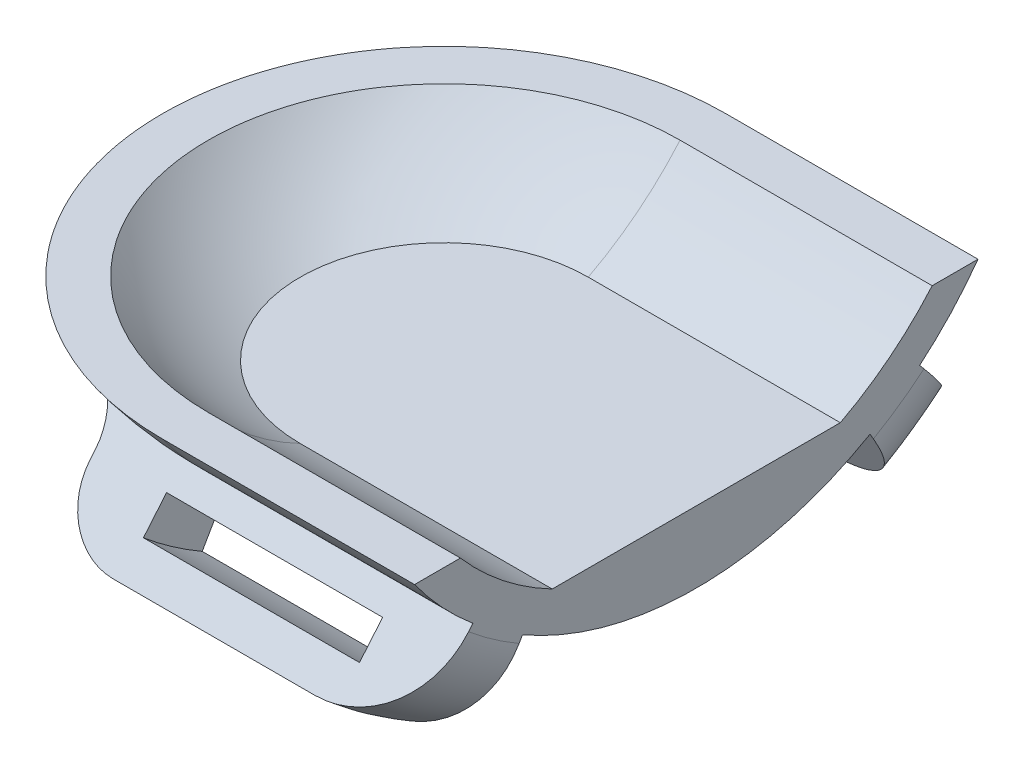
ISO-10303-21;
HEADER;
FILE_DESCRIPTION(('STEP AP214'),'2;1');
FILE_NAME('part.step','',(''),(''),'','','');
FILE_SCHEMA(('AUTOMOTIVE_DESIGN { 1 0 10303 214 1 1 1 1 }'));
ENDSEC;
DATA;
#1=APPLICATION_CONTEXT('core data for automotive mechanical design processes');
#2=APPLICATION_PROTOCOL_DEFINITION('international standard','automotive_design',2000,#1);
#3=PRODUCT_CONTEXT('',#1,'mechanical');
#4=PRODUCT('Part','Part','',(#3));
#5=PRODUCT_RELATED_PRODUCT_CATEGORY('part','',(#4));
#6=PRODUCT_DEFINITION_FORMATION('','',#4);
#7=PRODUCT_DEFINITION_CONTEXT('part definition',#1,'design');
#8=PRODUCT_DEFINITION('design','',#6,#7);
#9=PRODUCT_DEFINITION_SHAPE('','',#8);
#10=(LENGTH_UNIT() NAMED_UNIT(*) SI_UNIT(.MILLI.,.METRE.));
#11=(NAMED_UNIT(*) PLANE_ANGLE_UNIT() SI_UNIT($,.RADIAN.));
#12=(NAMED_UNIT(*) SI_UNIT($,.STERADIAN.) SOLID_ANGLE_UNIT());
#13=UNCERTAINTY_MEASURE_WITH_UNIT(LENGTH_MEASURE(1.E-05),#10,'distance_accuracy_value','');
#14=(GEOMETRIC_REPRESENTATION_CONTEXT(3) GLOBAL_UNCERTAINTY_ASSIGNED_CONTEXT((#13)) GLOBAL_UNIT_ASSIGNED_CONTEXT((#10,
#11,#12)) REPRESENTATION_CONTEXT('',''));
#15=CARTESIAN_POINT('',(0.,0.,0.));
#16=DIRECTION('',(0.,0.,1.));
#17=DIRECTION('',(1.,0.,0.));
#18=AXIS2_PLACEMENT_3D('',#15,#16,#17);
#19=CARTESIAN_POINT('',(-3.81,0.,0.));
#20=DIRECTION('',(0.,0.499999999999998,0.86602540378444));
#21=DIRECTION('',(0.,-0.86602540378444,0.499999999999998));
#22=AXIS2_PLACEMENT_3D('',#19,#20,#21);
#23=PLANE('',#22);
#24=DIRECTION('',(0.,-0.86602540378444,0.499999999999998));
#25=VECTOR('',#24,1.);
#26=CARTESIAN_POINT('',(8.89,0.,0.));
#27=LINE('',#26,#25);
#28=CARTESIAN_POINT('',(8.89,-10.6135743360802,6.12774999999997));
#29=VERTEX_POINT('',#28);
#30=CARTESIAN_POINT('',(8.89,-10.8196883821809,6.24674999999997));
#31=VERTEX_POINT('',#30);
#32=EDGE_CURVE('E296',#29,#31,#27,.T.);
#33=ORIENTED_EDGE('',*,*,#32,.T.);
#34=CARTESIAN_POINT('',(5.588,-10.8196883821809,6.24674999999997));
#35=DIRECTION('',(0.,0.499999999999998,0.86602540378444));
#36=DIRECTION('',(0.,-0.86602540378444,0.499999999999998));
#37=AXIS2_PLACEMENT_3D('',#34,#35,#36);
#38=CIRCLE('',#37,3.302);
#39=CARTESIAN_POINT('',(5.588,-13.6793042654771,7.89774999999996));
#40=VERTEX_POINT('',#39);
#41=EDGE_CURVE('E59',#31,#40,#38,.F.);
#42=ORIENTED_EDGE('',*,*,#41,.T.);
#43=DIRECTION('',(1.,0.,0.));
#44=VECTOR('',#43,1.);
#45=CARTESIAN_POINT('',(-3.81,-13.6793042654771,7.89774999999996));
#46=LINE('',#45,#44);
#47=CARTESIAN_POINT('',(-1.524,-13.6793042654771,7.89774999999996));
#48=VERTEX_POINT('',#47);
#49=EDGE_CURVE('E308',#48,#40,#46,.T.);
#50=ORIENTED_EDGE('',*,*,#49,.F.);
#51=CARTESIAN_POINT('',(-1.524,-11.6995701924259,6.75474999999997));
#52=DIRECTION('',(0.,0.499999999999998,0.86602540378444));
#53=DIRECTION('',(0.,-0.86602540378444,0.499999999999998));
#54=AXIS2_PLACEMENT_3D('',#51,#52,#53);
#55=CIRCLE('',#54,2.286);
#56=CARTESIAN_POINT('',(-3.81,-11.6995701924259,6.75474999999997));
#57=VERTEX_POINT('',#56);
#58=EDGE_CURVE('E404',#48,#57,#55,.F.);
#59=ORIENTED_EDGE('',*,*,#58,.T.);
#60=DIRECTION('',(0.,-0.86602540378444,0.499999999999998));
#61=VECTOR('',#60,1.);
#62=CARTESIAN_POINT('',(-3.81,0.,0.));
#63=LINE('',#62,#61);
#64=CARTESIAN_POINT('',(-3.81,-11.4333068133196,6.60102276639761));
#65=VERTEX_POINT('',#64);
#66=EDGE_CURVE('E297',#65,#57,#63,.T.);
#67=ORIENTED_EDGE('',*,*,#66,.F.);
#68=CARTESIAN_POINT('',(-6.096,-11.4333068133196,6.60102276639761));
#69=DIRECTION('',(0.,0.499999999999998,0.86602540378444));
#70=DIRECTION('',(0.,-0.86602540378444,0.499999999999998));
#71=AXIS2_PLACEMENT_3D('',#68,#69,#70);
#72=CIRCLE('',#71,2.286);
#73=CARTESIAN_POINT('',(-5.1376768558952,-9.63593106974097,5.56330739700759));
#74=VERTEX_POINT('',#73);
#75=EDGE_CURVE('E415',#65,#74,#72,.T.);
#76=ORIENTED_EDGE('',*,*,#75,.T.);
#77=CARTESIAN_POINT('',(0.,0.,0.));
#78=DIRECTION('',(0.,0.499999999999998,0.86602540378444));
#79=DIRECTION('',(0.,-0.86602540378444,0.499999999999998));
#80=AXIS2_PLACEMENT_3D('',#77,#78,#79);
#81=CIRCLE('',#80,12.2555);
#82=CARTESIAN_POINT('',(0.,-10.6135743360802,6.12774999999997));
#83=VERTEX_POINT('',#82);
#84=EDGE_CURVE('E316',#83,#74,#81,.F.);
#85=ORIENTED_EDGE('',*,*,#84,.F.);
#86=DIRECTION('',(-1.,0.,0.));
#87=VECTOR('',#86,1.);
#88=CARTESIAN_POINT('',(15.24,-10.6135743360802,6.12774999999997));
#89=LINE('',#88,#87);
#90=EDGE_CURVE('E318',#83,#29,#89,.F.);
#91=ORIENTED_EDGE('',*,*,#90,.T.);
#92=EDGE_LOOP('',(#33,#42,#50,#59,#67,#76,#85,#91));
#93=FACE_BOUND('',#92,.T.);
#94=DIRECTION('',(0.,-0.86602540378444,0.499999999999998));
#95=VECTOR('',#94,1.);
#96=CARTESIAN_POINT('',(6.35,0.,0.));
#97=LINE('',#96,#95);
#98=CARTESIAN_POINT('',(6.35,-11.4795997398646,6.62774999999997));
#99=VERTEX_POINT('',#98);
#100=CARTESIAN_POINT('',(6.35,-12.5794520026709,7.26274999999996));
#101=VERTEX_POINT('',#100);
#102=EDGE_CURVE('E253',#99,#101,#97,.T.);
#103=ORIENTED_EDGE('',*,*,#102,.F.);
#104=DIRECTION('',(1.,0.,0.));
#105=VECTOR('',#104,1.);
#106=CARTESIAN_POINT('',(8.89,-11.4795997398646,6.62774999999997));
#107=LINE('',#106,#105);
#108=CARTESIAN_POINT('',(-1.27,-11.4795997398646,6.62774999999997));
#109=VERTEX_POINT('',#108);
#110=EDGE_CURVE('E266',#109,#99,#107,.T.);
#111=ORIENTED_EDGE('',*,*,#110,.F.);
#112=DIRECTION('',(0.,0.86602540378444,-0.499999999999998));
#113=VECTOR('',#112,1.);
#114=CARTESIAN_POINT('',(-1.27,0.,0.));
#115=LINE('',#114,#113);
#116=CARTESIAN_POINT('',(-1.27,-12.5794520026709,7.26274999999996));
#117=VERTEX_POINT('',#116);
#118=EDGE_CURVE('E828',#117,#109,#115,.T.);
#119=ORIENTED_EDGE('',*,*,#118,.F.);
#120=DIRECTION('',(1.,0.,0.));
#121=VECTOR('',#120,1.);
#122=CARTESIAN_POINT('',(8.89,-12.5794520026709,7.26274999999996));
#123=LINE('',#122,#121);
#124=EDGE_CURVE('E244',#101,#117,#123,.F.);
#125=ORIENTED_EDGE('',*,*,#124,.F.);
#126=EDGE_LOOP('',(#103,#111,#119,#125));
#127=FACE_BOUND('',#126,.T.);
#128=ADVANCED_FACE('F37',(#93,#127),#23,.F.);
#129=CARTESIAN_POINT('',(-3.81,0.,0.));
#130=DIRECTION('',(0.,0.642787609686538,0.766044443118979));
#131=DIRECTION('',(0.,-0.766044443118979,0.642787609686538));
#132=AXIS2_PLACEMENT_3D('',#129,#130,#131);
#133=PLANE('',#132);
#134=DIRECTION('',(1.,0.,0.));
#135=VECTOR('',#134,1.);
#136=CARTESIAN_POINT('',(-3.81,-12.1000550012858,10.1531516888037));
#137=LINE('',#136,#135);
#138=CARTESIAN_POINT('',(-1.524,-12.1000550012858,10.1531516888037));
#139=VERTEX_POINT('',#138);
#140=CARTESIAN_POINT('',(5.588,-12.1000550012858,10.1531516888037));
#141=VERTEX_POINT('',#140);
#142=EDGE_CURVE('E304',#139,#141,#137,.T.);
#143=ORIENTED_EDGE('',*,*,#142,.T.);
#144=CARTESIAN_POINT('',(5.588,-9.57057625010697,8.03066700161876));
#145=DIRECTION('',(0.,0.642787609686538,0.766044443118979));
#146=DIRECTION('',(0.,-0.766044443118979,0.642787609686538));
#147=AXIS2_PLACEMENT_3D('',#144,#145,#146);
#148=CIRCLE('',#147,3.302);
#149=CARTESIAN_POINT('',(8.89,-9.57057625010697,8.03066700161876));
#150=VERTEX_POINT('',#149);
#151=EDGE_CURVE('E11',#141,#150,#148,.T.);
#152=ORIENTED_EDGE('',*,*,#151,.T.);
#153=DIRECTION('',(0.,-0.766044443118979,0.642787609686538));
#154=VECTOR('',#153,1.);
#155=CARTESIAN_POINT('',(8.89,0.,0.));
#156=LINE('',#155,#154);
#157=CARTESIAN_POINT('',(8.89,-9.38825767264465,7.87768355051336));
#158=VERTEX_POINT('',#157);
#159=EDGE_CURVE('E301',#158,#150,#156,.T.);
#160=ORIENTED_EDGE('',*,*,#159,.F.);
#161=DIRECTION('',(-1.,0.,0.));
#162=VECTOR('',#161,1.);
#163=CARTESIAN_POINT('',(15.24,-9.38825767264465,7.87768355051336));
#164=LINE('',#163,#162);
#165=CARTESIAN_POINT('',(0.,-9.38825767264465,7.87768355051337));
#166=VERTEX_POINT('',#165);
#167=EDGE_CURVE('E313',#166,#158,#164,.F.);
#168=ORIENTED_EDGE('',*,*,#167,.F.);
#169=CARTESIAN_POINT('',(0.,0.,0.));
#170=DIRECTION('',(0.,0.642787609686538,0.766044443118979));
#171=DIRECTION('',(0.,-0.766044443118979,0.642787609686538));
#172=AXIS2_PLACEMENT_3D('',#169,#170,#171);
#173=CIRCLE('',#172,12.2555);
#174=CARTESIAN_POINT('',(-5.13767685589519,-8.5234814336808,7.15205012734793));
#175=VERTEX_POINT('',#174);
#176=EDGE_CURVE('E310',#166,#175,#173,.F.);
#177=ORIENTED_EDGE('',*,*,#176,.T.);
#178=CARTESIAN_POINT('',(-6.096,-10.1133536182016,8.48611129099832));
#179=DIRECTION('',(0.,0.642787609686538,0.766044443118979));
#180=DIRECTION('',(0.,-0.766044443118979,0.642787609686538));
#181=AXIS2_PLACEMENT_3D('',#178,#179,#180);
#182=CIRCLE('',#181,2.286);
#183=CARTESIAN_POINT('',(-3.81,-10.1133536182016,8.48611129099832));
#184=VERTEX_POINT('',#183);
#185=EDGE_CURVE('E413',#175,#184,#182,.F.);
#186=ORIENTED_EDGE('',*,*,#185,.T.);
#187=DIRECTION('',(0.,-0.766044443118979,0.642787609686538));
#188=VECTOR('',#187,1.);
#189=CARTESIAN_POINT('',(-3.81,0.,0.));
#190=LINE('',#189,#188);
#191=CARTESIAN_POINT('',(-3.81,-10.3488774043158,8.68373921306028));
#192=VERTEX_POINT('',#191);
#193=EDGE_CURVE('E300',#184,#192,#190,.T.);
#194=ORIENTED_EDGE('',*,*,#193,.T.);
#195=CARTESIAN_POINT('',(-1.524,-10.3488774043159,8.68373921306028));
#196=DIRECTION('',(0.,0.642787609686538,0.766044443118979));
#197=DIRECTION('',(0.,-0.766044443118979,0.642787609686538));
#198=AXIS2_PLACEMENT_3D('',#195,#196,#197);
#199=CIRCLE('',#198,2.286);
#200=EDGE_CURVE('E406',#192,#139,#199,.T.);
#201=ORIENTED_EDGE('',*,*,#200,.T.);
#202=EDGE_LOOP('',(#143,#152,#160,#168,#177,#186,#194,#201));
#203=FACE_BOUND('',#202,.T.);
#204=DIRECTION('',(1.,0.,0.));
#205=VECTOR('',#204,1.);
#206=CARTESIAN_POINT('',(8.89,-10.1543021157636,8.5204711601999));
#207=LINE('',#206,#205);
#208=CARTESIAN_POINT('',(-1.27,-10.1543021157636,8.5204711601999));
#209=VERTEX_POINT('',#208);
#210=CARTESIAN_POINT('',(6.35,-10.1543021157636,8.5204711601999));
#211=VERTEX_POINT('',#210);
#212=EDGE_CURVE('E260',#209,#211,#207,.T.);
#213=ORIENTED_EDGE('',*,*,#212,.T.);
#214=DIRECTION('',(0.,-0.766044443118979,0.642787609686538));
#215=VECTOR('',#214,1.);
#216=CARTESIAN_POINT('',(6.35,0.,0.));
#217=LINE('',#216,#215);
#218=CARTESIAN_POINT('',(6.35,-11.1271785585247,9.33681142450181));
#219=VERTEX_POINT('',#218);
#220=EDGE_CURVE('E250',#211,#219,#217,.T.);
#221=ORIENTED_EDGE('',*,*,#220,.T.);
#222=DIRECTION('',(1.,0.,0.));
#223=VECTOR('',#222,1.);
#224=CARTESIAN_POINT('',(8.89,-11.1271785585247,9.3368114245018));
#225=LINE('',#224,#223);
#226=CARTESIAN_POINT('',(-1.27,-11.1271785585247,9.3368114245018));
#227=VERTEX_POINT('',#226);
#228=EDGE_CURVE('E233',#219,#227,#225,.F.);
#229=ORIENTED_EDGE('',*,*,#228,.T.);
#230=DIRECTION('',(0.,0.766044443118979,-0.642787609686538));
#231=VECTOR('',#230,1.);
#232=CARTESIAN_POINT('',(-1.27,0.,0.));
#233=LINE('',#232,#231);
#234=EDGE_CURVE('E833',#227,#209,#233,.T.);
#235=ORIENTED_EDGE('',*,*,#234,.T.);
#236=EDGE_LOOP('',(#213,#221,#229,#235));
#237=FACE_BOUND('',#236,.T.);
#238=ADVANCED_FACE('F259',(#203,#237),#133,.T.);
#239=CARTESIAN_POINT('',(-3.81,0.,0.));
#240=DIRECTION('',(0.,-0.642787609686538,0.766044443118979));
#241=DIRECTION('',(0.,-0.766044443118979,-0.642787609686538));
#242=AXIS2_PLACEMENT_3D('',#239,#240,#241);
#243=PLANE('',#242);
#244=DIRECTION('',(0.,-0.766044443118979,-0.642787609686538));
#245=VECTOR('',#244,1.);
#246=CARTESIAN_POINT('',(8.89,0.,0.));
#247=LINE('',#246,#245);
#248=CARTESIAN_POINT('',(8.89,-9.38825767264465,-7.87768355051337));
#249=VERTEX_POINT('',#248);
#250=CARTESIAN_POINT('',(8.89,-9.57057625010696,-8.03066700161876));
#251=VERTEX_POINT('',#250);
#252=EDGE_CURVE('E263',#249,#251,#247,.T.);
#253=ORIENTED_EDGE('',*,*,#252,.T.);
#254=CARTESIAN_POINT('',(5.588,-9.57057625010697,-8.03066700161876));
#255=DIRECTION('',(0.,-0.642787609686538,0.766044443118979));
#256=DIRECTION('',(0.,-0.766044443118979,-0.642787609686538));
#257=AXIS2_PLACEMENT_3D('',#254,#255,#256);
#258=CIRCLE('',#257,3.302);
#259=CARTESIAN_POINT('',(5.588,-12.1000550012858,-10.1531516888037));
#260=VERTEX_POINT('',#259);
#261=EDGE_CURVE('E424',#251,#260,#258,.F.);
#262=ORIENTED_EDGE('',*,*,#261,.T.);
#263=DIRECTION('',(1.,0.,0.));
#264=VECTOR('',#263,1.);
#265=CARTESIAN_POINT('',(-3.81,-12.1000550012858,-10.1531516888037));
#266=LINE('',#265,#264);
#267=CARTESIAN_POINT('',(-1.524,-12.1000550012858,-10.1531516888037));
#268=VERTEX_POINT('',#267);
#269=EDGE_CURVE('E282',#268,#260,#266,.T.);
#270=ORIENTED_EDGE('',*,*,#269,.F.);
#271=CARTESIAN_POINT('',(-1.524,-10.3488774043159,-8.68373921306028));
#272=DIRECTION('',(0.,-0.642787609686538,0.766044443118979));
#273=DIRECTION('',(0.,-0.766044443118979,-0.642787609686538));
#274=AXIS2_PLACEMENT_3D('',#271,#272,#273);
#275=CIRCLE('',#274,2.286);
#276=CARTESIAN_POINT('',(-3.81,-10.3488774043158,-8.68373921306028));
#277=VERTEX_POINT('',#276);
#278=EDGE_CURVE('E393',#268,#277,#275,.F.);
#279=ORIENTED_EDGE('',*,*,#278,.T.);
#280=DIRECTION('',(0.,-0.766044443118979,-0.642787609686538));
#281=VECTOR('',#280,1.);
#282=CARTESIAN_POINT('',(-3.81,0.,0.));
#283=LINE('',#282,#281);
#284=CARTESIAN_POINT('',(-3.81,-10.1133536182016,-8.48611129099832));
#285=VERTEX_POINT('',#284);
#286=EDGE_CURVE('E270',#285,#277,#283,.T.);
#287=ORIENTED_EDGE('',*,*,#286,.F.);
#288=CARTESIAN_POINT('',(-6.096,-10.1133536182016,-8.48611129099832));
#289=DIRECTION('',(0.,-0.642787609686538,0.766044443118979));
#290=DIRECTION('',(0.,-0.766044443118979,-0.642787609686538));
#291=AXIS2_PLACEMENT_3D('',#288,#289,#290);
#292=CIRCLE('',#291,2.286);
#293=CARTESIAN_POINT('',(-5.1376768558952,-8.5234814336808,-7.15205012734793));
#294=VERTEX_POINT('',#293);
#295=EDGE_CURVE('E410',#285,#294,#292,.T.);
#296=ORIENTED_EDGE('',*,*,#295,.T.);
#297=CARTESIAN_POINT('',(0.,0.,0.));
#298=DIRECTION('',(0.,-0.642787609686538,0.766044443118979));
#299=DIRECTION('',(0.,-0.766044443118979,-0.642787609686538));
#300=AXIS2_PLACEMENT_3D('',#297,#298,#299);
#301=CIRCLE('',#300,12.2555);
#302=CARTESIAN_POINT('',(0.,-9.38825767264465,-7.87768355051337));
#303=VERTEX_POINT('',#302);
#304=EDGE_CURVE('E292',#303,#294,#301,.F.);
#305=ORIENTED_EDGE('',*,*,#304,.F.);
#306=DIRECTION('',(-1.,0.,0.));
#307=VECTOR('',#306,1.);
#308=CARTESIAN_POINT('',(15.24,-9.38825767264465,-7.87768355051337));
#309=LINE('',#308,#307);
#310=EDGE_CURVE('E294',#303,#249,#309,.F.);
#311=ORIENTED_EDGE('',*,*,#310,.T.);
#312=EDGE_LOOP('',(#253,#262,#270,#279,#287,#296,#305,#311));
#313=FACE_BOUND('',#312,.T.);
#314=DIRECTION('',(0.,-0.766044443118979,-0.642787609686538));
#315=VECTOR('',#314,1.);
#316=CARTESIAN_POINT('',(6.35,0.,0.));
#317=LINE('',#316,#315);
#318=CARTESIAN_POINT('',(6.35,-10.1543021157636,-8.5204711601999));
#319=VERTEX_POINT('',#318);
#320=CARTESIAN_POINT('',(6.35,-11.1271785585247,-9.3368114245018));
#321=VERTEX_POINT('',#320);
#322=EDGE_CURVE('E261',#319,#321,#317,.T.);
#323=ORIENTED_EDGE('',*,*,#322,.F.);
#324=DIRECTION('',(1.,0.,0.));
#325=VECTOR('',#324,1.);
#326=CARTESIAN_POINT('',(8.89,-10.1543021157636,-8.5204711601999));
#327=LINE('',#326,#325);
#328=CARTESIAN_POINT('',(-1.27,-10.1543021157636,-8.5204711601999));
#329=VERTEX_POINT('',#328);
#330=EDGE_CURVE('E832',#329,#319,#327,.T.);
#331=ORIENTED_EDGE('',*,*,#330,.F.);
#332=DIRECTION('',(0.,0.766044443118979,0.642787609686538));
#333=VECTOR('',#332,1.);
#334=CARTESIAN_POINT('',(-1.27,0.,0.));
#335=LINE('',#334,#333);
#336=CARTESIAN_POINT('',(-1.27,-11.1271785585247,-9.33681142450181));
#337=VERTEX_POINT('',#336);
#338=EDGE_CURVE('E842',#337,#329,#335,.T.);
#339=ORIENTED_EDGE('',*,*,#338,.F.);
#340=DIRECTION('',(1.,0.,0.));
#341=VECTOR('',#340,1.);
#342=CARTESIAN_POINT('',(8.89,-11.1271785585247,-9.3368114245018));
#343=LINE('',#342,#341);
#344=EDGE_CURVE('E245',#321,#337,#343,.F.);
#345=ORIENTED_EDGE('',*,*,#344,.F.);
#346=EDGE_LOOP('',(#323,#331,#339,#345));
#347=FACE_BOUND('',#346,.T.);
#348=ADVANCED_FACE('F446',(#313,#347),#243,.F.);
#349=CARTESIAN_POINT('',(-3.81,0.,0.));
#350=DIRECTION('',(0.,-0.499999999999998,0.86602540378444));
#351=DIRECTION('',(0.,-0.86602540378444,-0.499999999999998));
#352=AXIS2_PLACEMENT_3D('',#349,#350,#351);
#353=PLANE('',#352);
#354=DIRECTION('',(1.,0.,0.));
#355=VECTOR('',#354,1.);
#356=CARTESIAN_POINT('',(-3.81,-13.6793042654771,-7.89774999999996));
#357=LINE('',#356,#355);
#358=CARTESIAN_POINT('',(-1.524,-13.6793042654771,-7.89774999999996));
#359=VERTEX_POINT('',#358);
#360=CARTESIAN_POINT('',(5.588,-13.6793042654771,-7.89774999999996));
#361=VERTEX_POINT('',#360);
#362=EDGE_CURVE('E277',#359,#361,#357,.T.);
#363=ORIENTED_EDGE('',*,*,#362,.T.);
#364=CARTESIAN_POINT('',(5.588,-10.8196883821809,-6.24674999999997));
#365=DIRECTION('',(0.,-0.499999999999998,0.86602540378444));
#366=DIRECTION('',(0.,-0.86602540378444,-0.499999999999998));
#367=AXIS2_PLACEMENT_3D('',#364,#365,#366);
#368=CIRCLE('',#367,3.302);
#369=CARTESIAN_POINT('',(8.89,-10.8196883821809,-6.24674999999997));
#370=VERTEX_POINT('',#369);
#371=EDGE_CURVE('E428',#361,#370,#368,.T.);
#372=ORIENTED_EDGE('',*,*,#371,.T.);
#373=DIRECTION('',(0.,-0.86602540378444,-0.499999999999998));
#374=VECTOR('',#373,1.);
#375=CARTESIAN_POINT('',(8.89,0.,0.));
#376=LINE('',#375,#374);
#377=CARTESIAN_POINT('',(8.89,-10.6135743360802,-6.12774999999997));
#378=VERTEX_POINT('',#377);
#379=EDGE_CURVE('E274',#378,#370,#376,.T.);
#380=ORIENTED_EDGE('',*,*,#379,.F.);
#381=DIRECTION('',(-1.,0.,0.));
#382=VECTOR('',#381,1.);
#383=CARTESIAN_POINT('',(15.24,-10.6135743360802,-6.12774999999997));
#384=LINE('',#383,#382);
#385=CARTESIAN_POINT('',(0.,-10.6135743360802,-6.12774999999997));
#386=VERTEX_POINT('',#385);
#387=EDGE_CURVE('E289',#386,#378,#384,.F.);
#388=ORIENTED_EDGE('',*,*,#387,.F.);
#389=CARTESIAN_POINT('',(0.,0.,0.));
#390=DIRECTION('',(0.,-0.499999999999998,0.86602540378444));
#391=DIRECTION('',(0.,-0.86602540378444,-0.499999999999998));
#392=AXIS2_PLACEMENT_3D('',#389,#390,#391);
#393=CIRCLE('',#392,12.2555);
#394=CARTESIAN_POINT('',(-5.1376768558952,-9.63593106974097,-5.56330739700759));
#395=VERTEX_POINT('',#394);
#396=EDGE_CURVE('E285',#386,#395,#393,.F.);
#397=ORIENTED_EDGE('',*,*,#396,.T.);
#398=CARTESIAN_POINT('',(-6.096,-11.4333068133196,-6.60102276639761));
#399=DIRECTION('',(0.,-0.499999999999998,0.86602540378444));
#400=DIRECTION('',(0.,-0.86602540378444,-0.499999999999998));
#401=AXIS2_PLACEMENT_3D('',#398,#399,#400);
#402=CIRCLE('',#401,2.286);
#403=CARTESIAN_POINT('',(-3.81,-11.4333068133196,-6.60102276639761));
#404=VERTEX_POINT('',#403);
#405=EDGE_CURVE('E408',#395,#404,#402,.F.);
#406=ORIENTED_EDGE('',*,*,#405,.T.);
#407=DIRECTION('',(0.,-0.86602540378444,-0.499999999999998));
#408=VECTOR('',#407,1.);
#409=CARTESIAN_POINT('',(-3.81,0.,0.));
#410=LINE('',#409,#408);
#411=CARTESIAN_POINT('',(-3.81,-11.6995701924259,-6.75474999999997));
#412=VERTEX_POINT('',#411);
#413=EDGE_CURVE('E273',#404,#412,#410,.T.);
#414=ORIENTED_EDGE('',*,*,#413,.T.);
#415=CARTESIAN_POINT('',(-1.524,-11.6995701924259,-6.75474999999997));
#416=DIRECTION('',(0.,-0.499999999999998,0.86602540378444));
#417=DIRECTION('',(0.,-0.86602540378444,-0.499999999999998));
#418=AXIS2_PLACEMENT_3D('',#415,#416,#417);
#419=CIRCLE('',#418,2.286);
#420=EDGE_CURVE('E395',#412,#359,#419,.T.);
#421=ORIENTED_EDGE('',*,*,#420,.T.);
#422=EDGE_LOOP('',(#363,#372,#380,#388,#397,#406,#414,#421));
#423=FACE_BOUND('',#422,.T.);
#424=DIRECTION('',(1.,0.,0.));
#425=VECTOR('',#424,1.);
#426=CARTESIAN_POINT('',(8.89,-11.4795997398646,-6.62774999999997));
#427=LINE('',#426,#425);
#428=CARTESIAN_POINT('',(-1.27,-11.4795997398646,-6.62774999999997));
#429=VERTEX_POINT('',#428);
#430=CARTESIAN_POINT('',(6.35,-11.4795997398646,-6.62774999999997));
#431=VERTEX_POINT('',#430);
#432=EDGE_CURVE('E374',#429,#431,#427,.T.);
#433=ORIENTED_EDGE('',*,*,#432,.T.);
#434=DIRECTION('',(0.,-0.86602540378444,-0.499999999999998));
#435=VECTOR('',#434,1.);
#436=CARTESIAN_POINT('',(6.35,0.,0.));
#437=LINE('',#436,#435);
#438=CARTESIAN_POINT('',(6.35,-12.5794520026709,-7.26274999999996));
#439=VERTEX_POINT('',#438);
#440=EDGE_CURVE('E377',#431,#439,#437,.T.);
#441=ORIENTED_EDGE('',*,*,#440,.T.);
#442=DIRECTION('',(1.,0.,0.));
#443=VECTOR('',#442,1.);
#444=CARTESIAN_POINT('',(8.89,-12.5794520026709,-7.26274999999996));
#445=LINE('',#444,#443);
#446=CARTESIAN_POINT('',(-1.27,-12.5794520026709,-7.26274999999996));
#447=VERTEX_POINT('',#446);
#448=EDGE_CURVE('E366',#439,#447,#445,.F.);
#449=ORIENTED_EDGE('',*,*,#448,.T.);
#450=DIRECTION('',(0.,0.86602540378444,0.499999999999998));
#451=VECTOR('',#450,1.);
#452=CARTESIAN_POINT('',(-1.27,0.,0.));
#453=LINE('',#452,#451);
#454=EDGE_CURVE('E371',#447,#429,#453,.T.);
#455=ORIENTED_EDGE('',*,*,#454,.T.);
#456=EDGE_LOOP('',(#433,#441,#449,#455));
#457=FACE_BOUND('',#456,.T.);
#458=ADVANCED_FACE('F432',(#423,#457),#353,.T.);
#459=CARTESIAN_POINT('',(15.24,0.,0.));
#460=DIRECTION('',(-1.,0.,0.));
#461=DIRECTION('',(0.,0.,1.));
#462=AXIS2_PLACEMENT_3D('',#459,#460,#461);
#463=CYLINDRICAL_SURFACE('',#462,12.2555);
#464=ORIENTED_EDGE('',*,*,#310,.F.);
#465=CARTESIAN_POINT('',(0.,0.,0.));
#466=DIRECTION('',(1.,0.,0.));
#467=DIRECTION('',(0.,0.,-1.));
#468=AXIS2_PLACEMENT_3D('',#465,#466,#467);
#469=CIRCLE('',#468,12.2555);
#470=CARTESIAN_POINT('',(0.,-7.1755,-9.93526446552884));
#471=VERTEX_POINT('',#470);
#472=EDGE_CURVE('E356',#303,#471,#469,.T.);
#473=ORIENTED_EDGE('',*,*,#472,.T.);
#474=DIRECTION('',(-1.,0.,0.));
#475=VECTOR('',#474,1.);
#476=CARTESIAN_POINT('',(15.24,-7.1755,-9.93526446552884));
#477=LINE('',#476,#475);
#478=CARTESIAN_POINT('',(8.89,-7.1755,-9.93526446552884));
#479=VERTEX_POINT('',#478);
#480=EDGE_CURVE('E327',#471,#479,#477,.F.);
#481=ORIENTED_EDGE('',*,*,#480,.T.);
#482=CARTESIAN_POINT('',(8.89,0.,0.));
#483=DIRECTION('',(-1.,0.,0.));
#484=DIRECTION('',(0.,0.,1.));
#485=AXIS2_PLACEMENT_3D('',#482,#483,#484);
#486=CIRCLE('',#485,12.2555);
#487=EDGE_CURVE('E353',#479,#249,#486,.T.);
#488=ORIENTED_EDGE('',*,*,#487,.T.);
#489=EDGE_LOOP('',(#464,#473,#481,#488));
#490=FACE_BOUND('',#489,.T.);
#491=ADVANCED_FACE('F469',(#490),#463,.T.);
#492=CARTESIAN_POINT('',(0.,0.,0.));
#493=DIRECTION('',(1.,0.,0.));
#494=DIRECTION('',(0.,0.,-1.));
#495=AXIS2_PLACEMENT_3D('',#492,#493,#494);
#496=SPHERICAL_SURFACE('',#495,12.2555);
#497=CARTESIAN_POINT('',(-5.1376768558952,0.,0.));
#498=DIRECTION('',(1.,0.,0.));
#499=DIRECTION('',(0.,0.,-1.));
#500=AXIS2_PLACEMENT_3D('',#497,#498,#499);
#501=CIRCLE('',#500,11.1266147940152);
#502=EDGE_CURVE('E383',#294,#395,#501,.F.);
#503=ORIENTED_EDGE('',*,*,#502,.T.);
#504=ORIENTED_EDGE('',*,*,#396,.F.);
#505=EDGE_CURVE('E363',#83,#386,#469,.T.);
#506=ORIENTED_EDGE('',*,*,#505,.F.);
#507=ORIENTED_EDGE('',*,*,#84,.T.);
#508=CARTESIAN_POINT('',(-5.1376768558952,0.,0.));
#509=DIRECTION('',(1.,0.,0.));
#510=DIRECTION('',(0.,0.,-1.));
#511=AXIS2_PLACEMENT_3D('',#508,#509,#510);
#512=CIRCLE('',#511,11.1266147940152);
#513=EDGE_CURVE('E380',#74,#175,#512,.F.);
#514=ORIENTED_EDGE('',*,*,#513,.T.);
#515=ORIENTED_EDGE('',*,*,#176,.F.);
#516=CARTESIAN_POINT('',(0.,-7.1755,9.93526446552884));
#517=VERTEX_POINT('',#516);
#518=EDGE_CURVE('E359',#517,#166,#469,.T.);
#519=ORIENTED_EDGE('',*,*,#518,.F.);
#520=CARTESIAN_POINT('',(0.,-7.1755,0.));
#521=DIRECTION('',(0.,-1.,0.));
#522=DIRECTION('',(1.,0.,0.));
#523=AXIS2_PLACEMENT_3D('',#520,#521,#522);
#524=CIRCLE('',#523,9.93526446552884);
#525=EDGE_CURVE('E325',#471,#517,#524,.F.);
#526=ORIENTED_EDGE('',*,*,#525,.F.);
#527=ORIENTED_EDGE('',*,*,#472,.F.);
#528=ORIENTED_EDGE('',*,*,#304,.T.);
#529=EDGE_LOOP('',(#503,#504,#506,#507,#514,#515,#519,#526,#527,#528));
#530=FACE_BOUND('',#529,.T.);
#531=ADVANCED_FACE('F473',(#530),#496,.T.);
#532=ORIENTED_EDGE('',*,*,#505,.T.);
#533=ORIENTED_EDGE('',*,*,#387,.T.);
#534=EDGE_CURVE('E357',#378,#29,#486,.T.);
#535=ORIENTED_EDGE('',*,*,#534,.T.);
#536=ORIENTED_EDGE('',*,*,#90,.F.);
#537=EDGE_LOOP('',(#532,#533,#535,#536));
#538=FACE_BOUND('',#537,.T.);
#539=ADVANCED_FACE('F479',(#538),#463,.T.);
#540=CARTESIAN_POINT('',(15.24,0.,0.));
#541=DIRECTION('',(-1.,0.,0.));
#542=DIRECTION('',(0.,0.,1.));
#543=AXIS2_PLACEMENT_3D('',#540,#541,#542);
#544=CYLINDRICAL_SURFACE('',#543,10.9855);
#545=DIRECTION('',(-1.,0.,0.));
#546=VECTOR('',#545,1.);
#547=CARTESIAN_POINT('',(15.24,-7.1755,8.31825763005691));
#548=LINE('',#547,#546);
#549=CARTESIAN_POINT('',(8.89,-7.1755,8.31825763005691));
#550=VERTEX_POINT('',#549);
#551=CARTESIAN_POINT('',(0.,-7.1755,8.31825763005691));
#552=VERTEX_POINT('',#551);
#553=EDGE_CURVE('E338',#550,#552,#548,.T.);
#554=ORIENTED_EDGE('',*,*,#553,.F.);
#555=CARTESIAN_POINT('',(8.89,0.,0.));
#556=DIRECTION('',(-1.,0.,0.));
#557=DIRECTION('',(0.,0.,1.));
#558=AXIS2_PLACEMENT_3D('',#555,#556,#557);
#559=CIRCLE('',#558,10.9855);
#560=CARTESIAN_POINT('',(8.89,-9.74037012900434,5.08));
#561=VERTEX_POINT('',#560);
#562=EDGE_CURVE('E367',#561,#550,#559,.T.);
#563=ORIENTED_EDGE('',*,*,#562,.F.);
#564=DIRECTION('',(1.,0.,0.));
#565=VECTOR('',#564,1.);
#566=CARTESIAN_POINT('',(-12.2565,-9.74037012900434,5.08000000000001));
#567=LINE('',#566,#565);
#568=CARTESIAN_POINT('',(0.,-9.74037012900433,5.08));
#569=VERTEX_POINT('',#568);
#570=EDGE_CURVE('E340',#569,#561,#567,.T.);
#571=ORIENTED_EDGE('',*,*,#570,.F.);
#572=CARTESIAN_POINT('',(0.,0.,0.));
#573=DIRECTION('',(1.,0.,0.));
#574=DIRECTION('',(0.,0.,-1.));
#575=AXIS2_PLACEMENT_3D('',#572,#573,#574);
#576=CIRCLE('',#575,10.9855);
#577=EDGE_CURVE('E362',#552,#569,#576,.T.);
#578=ORIENTED_EDGE('',*,*,#577,.F.);
#579=EDGE_LOOP('',(#554,#563,#571,#578));
#580=FACE_BOUND('',#579,.T.);
#581=ADVANCED_FACE('F526',(#580),#544,.F.);
#582=ORIENTED_EDGE('',*,*,#518,.T.);
#583=ORIENTED_EDGE('',*,*,#167,.T.);
#584=CARTESIAN_POINT('',(8.89,-7.1755,9.93526446552884));
#585=VERTEX_POINT('',#584);
#586=EDGE_CURVE('E358',#158,#585,#486,.T.);
#587=ORIENTED_EDGE('',*,*,#586,.T.);
#588=DIRECTION('',(-1.,0.,0.));
#589=VECTOR('',#588,1.);
#590=CARTESIAN_POINT('',(15.24,-7.1755,9.93526446552884));
#591=LINE('',#590,#589);
#592=EDGE_CURVE('E330',#585,#517,#591,.T.);
#593=ORIENTED_EDGE('',*,*,#592,.T.);
#594=EDGE_LOOP('',(#582,#583,#587,#593));
#595=FACE_BOUND('',#594,.T.);
#596=ADVANCED_FACE('F507',(#595),#463,.T.);
#597=CARTESIAN_POINT('',(0.,0.,0.));
#598=DIRECTION('',(1.,0.,0.));
#599=DIRECTION('',(0.,0.,-1.));
#600=AXIS2_PLACEMENT_3D('',#597,#598,#599);
#601=SPHERICAL_SURFACE('',#600,10.9855);
#602=CARTESIAN_POINT('',(0.,-9.74037012900434,-5.08));
#603=VERTEX_POINT('',#602);
#604=CARTESIAN_POINT('',(0.,-7.1755,-8.31825763005691));
#605=VERTEX_POINT('',#604);
#606=EDGE_CURVE('E364',#603,#605,#576,.T.);
#607=ORIENTED_EDGE('',*,*,#606,.T.);
#608=CARTESIAN_POINT('',(0.,-7.1755,0.));
#609=DIRECTION('',(0.,-1.,0.));
#610=DIRECTION('',(1.,0.,0.));
#611=AXIS2_PLACEMENT_3D('',#608,#609,#610);
#612=CIRCLE('',#611,8.31825763005691);
#613=EDGE_CURVE('E335',#605,#552,#612,.F.);
#614=ORIENTED_EDGE('',*,*,#613,.T.);
#615=ORIENTED_EDGE('',*,*,#577,.T.);
#616=CARTESIAN_POINT('',(0.,-9.74037012900434,0.));
#617=DIRECTION('',(0.,-1.,0.));
#618=DIRECTION('',(0.,0.,-1.));
#619=AXIS2_PLACEMENT_3D('',#616,#617,#618);
#620=CIRCLE('',#619,5.08);
#621=EDGE_CURVE('E347',#569,#603,#620,.T.);
#622=ORIENTED_EDGE('',*,*,#621,.T.);
#623=EDGE_LOOP('',(#607,#614,#615,#622));
#624=FACE_BOUND('',#623,.T.);
#625=ADVANCED_FACE('F522',(#624),#601,.F.);
#626=DIRECTION('',(1.,0.,0.));
#627=VECTOR('',#626,1.);
#628=CARTESIAN_POINT('',(-12.2565,-9.74037012900434,-5.08));
#629=LINE('',#628,#627);
#630=CARTESIAN_POINT('',(8.89,-9.74037012900434,-5.08));
#631=VERTEX_POINT('',#630);
#632=EDGE_CURVE('E344',#603,#631,#629,.T.);
#633=ORIENTED_EDGE('',*,*,#632,.T.);
#634=CARTESIAN_POINT('',(8.89,-7.1755,-8.31825763005691));
#635=VERTEX_POINT('',#634);
#636=EDGE_CURVE('E352',#635,#631,#559,.T.);
#637=ORIENTED_EDGE('',*,*,#636,.F.);
#638=DIRECTION('',(-1.,0.,0.));
#639=VECTOR('',#638,1.);
#640=CARTESIAN_POINT('',(15.24,-7.1755,-8.31825763005691));
#641=LINE('',#640,#639);
#642=EDGE_CURVE('E333',#605,#635,#641,.F.);
#643=ORIENTED_EDGE('',*,*,#642,.F.);
#644=ORIENTED_EDGE('',*,*,#606,.F.);
#645=EDGE_LOOP('',(#633,#637,#643,#644));
#646=FACE_BOUND('',#645,.T.);
#647=ADVANCED_FACE('F515',(#646),#544,.F.);
#648=CARTESIAN_POINT('',(8.89,-12.2555,-12.2555));
#649=DIRECTION('',(-1.,0.,0.));
#650=DIRECTION('',(0.,0.,1.));
#651=AXIS2_PLACEMENT_3D('',#648,#649,#650);
#652=PLANE('',#651);
#653=ORIENTED_EDGE('',*,*,#379,.T.);
#654=CARTESIAN_POINT('',(8.89,0.,0.));
#655=DIRECTION('',(-1.,0.,0.));
#656=DIRECTION('',(0.,0.,1.));
#657=AXIS2_PLACEMENT_3D('',#654,#655,#656);
#658=CIRCLE('',#657,12.4935);
#659=EDGE_CURVE('E421',#370,#251,#658,.F.);
#660=ORIENTED_EDGE('',*,*,#659,.T.);
#661=ORIENTED_EDGE('',*,*,#252,.F.);
#662=ORIENTED_EDGE('',*,*,#487,.F.);
#663=DIRECTION('',(0.,0.,1.));
#664=VECTOR('',#663,1.);
#665=CARTESIAN_POINT('',(8.89,-7.1755,-12.2555));
#666=LINE('',#665,#664);
#667=EDGE_CURVE('E324',#479,#635,#666,.T.);
#668=ORIENTED_EDGE('',*,*,#667,.T.);
#669=ORIENTED_EDGE('',*,*,#636,.T.);
#670=DIRECTION('',(0.,0.,-1.));
#671=VECTOR('',#670,1.);
#672=CARTESIAN_POINT('',(8.89,-9.74037012900434,0.));
#673=LINE('',#672,#671);
#674=EDGE_CURVE('E341',#561,#631,#673,.T.);
#675=ORIENTED_EDGE('',*,*,#674,.F.);
#676=ORIENTED_EDGE('',*,*,#562,.T.);
#677=EDGE_CURVE('E321',#550,#585,#666,.T.);
#678=ORIENTED_EDGE('',*,*,#677,.T.);
#679=ORIENTED_EDGE('',*,*,#586,.F.);
#680=ORIENTED_EDGE('',*,*,#159,.T.);
#681=CARTESIAN_POINT('',(8.89,0.,0.));
#682=DIRECTION('',(-1.,0.,0.));
#683=DIRECTION('',(0.,0.,1.));
#684=AXIS2_PLACEMENT_3D('',#681,#682,#683);
#685=CIRCLE('',#684,12.4935);
#686=EDGE_CURVE('E418',#150,#31,#685,.F.);
#687=ORIENTED_EDGE('',*,*,#686,.T.);
#688=ORIENTED_EDGE('',*,*,#32,.F.);
#689=ORIENTED_EDGE('',*,*,#534,.F.);
#690=EDGE_LOOP('',(#653,#660,#661,#662,#668,#669,#675,#676,#678,#679,#680,#687,#688,#689));
#691=FACE_BOUND('',#690,.T.);
#692=ADVANCED_FACE('F440',(#691),#652,.F.);
#693=CARTESIAN_POINT('',(-12.2565,-9.74037012900434,0.));
#694=DIRECTION('',(0.,-1.,0.));
#695=DIRECTION('',(0.,0.,-1.));
#696=AXIS2_PLACEMENT_3D('',#693,#694,#695);
#697=PLANE('',#696);
#698=ORIENTED_EDGE('',*,*,#621,.F.);
#699=ORIENTED_EDGE('',*,*,#570,.T.);
#700=ORIENTED_EDGE('',*,*,#674,.T.);
#701=ORIENTED_EDGE('',*,*,#632,.F.);
#702=EDGE_LOOP('',(#698,#699,#700,#701));
#703=FACE_BOUND('',#702,.T.);
#704=ADVANCED_FACE('F519',(#703),#697,.F.);
#705=CARTESIAN_POINT('',(8.89,-7.1755,-12.2555));
#706=DIRECTION('',(0.,-1.,0.));
#707=DIRECTION('',(1.,0.,0.));
#708=AXIS2_PLACEMENT_3D('',#705,#706,#707);
#709=PLANE('',#708);
#710=ORIENTED_EDGE('',*,*,#553,.T.);
#711=ORIENTED_EDGE('',*,*,#613,.F.);
#712=ORIENTED_EDGE('',*,*,#642,.T.);
#713=ORIENTED_EDGE('',*,*,#667,.F.);
#714=ORIENTED_EDGE('',*,*,#480,.F.);
#715=ORIENTED_EDGE('',*,*,#525,.T.);
#716=ORIENTED_EDGE('',*,*,#592,.F.);
#717=ORIENTED_EDGE('',*,*,#677,.F.);
#718=EDGE_LOOP('',(#710,#711,#712,#713,#714,#715,#716,#717));
#719=FACE_BOUND('',#718,.T.);
#720=ADVANCED_FACE('F509',(#719),#709,.F.);
#721=CARTESIAN_POINT('',(-3.81,0.,0.));
#722=DIRECTION('',(1.,0.,0.));
#723=DIRECTION('',(0.,0.,-1.));
#724=AXIS2_PLACEMENT_3D('',#721,#722,#723);
#725=CYLINDRICAL_SURFACE('',#724,15.7955);
#726=ORIENTED_EDGE('',*,*,#49,.T.);
#727=CARTESIAN_POINT('',(5.588,0.,0.));
#728=DIRECTION('',(-1.,0.,0.));
#729=DIRECTION('',(0.,0.,1.));
#730=AXIS2_PLACEMENT_3D('',#727,#728,#729);
#731=CIRCLE('',#730,15.7955);
#732=EDGE_CURVE('E45',#40,#141,#731,.T.);
#733=ORIENTED_EDGE('',*,*,#732,.T.);
#734=ORIENTED_EDGE('',*,*,#142,.F.);
#735=CARTESIAN_POINT('',(-1.524,0.,0.));
#736=DIRECTION('',(1.,0.,0.));
#737=DIRECTION('',(0.,0.,-1.));
#738=AXIS2_PLACEMENT_3D('',#735,#736,#737);
#739=CIRCLE('',#738,15.7955);
#740=EDGE_CURVE('E401',#139,#48,#739,.T.);
#741=ORIENTED_EDGE('',*,*,#740,.T.);
#742=EDGE_LOOP('',(#726,#733,#734,#741));
#743=FACE_BOUND('',#742,.T.);
#744=ADVANCED_FACE('F500',(#743),#725,.T.);
#745=CARTESIAN_POINT('',(-3.81,0.,0.));
#746=DIRECTION('',(1.,0.,0.));
#747=DIRECTION('',(0.,0.,-1.));
#748=AXIS2_PLACEMENT_3D('',#745,#746,#747);
#749=PLANE('',#748);
#750=ORIENTED_EDGE('',*,*,#193,.F.);
#751=CARTESIAN_POINT('',(-3.81,0.,0.));
#752=DIRECTION('',(1.,0.,0.));
#753=DIRECTION('',(0.,0.,-1.));
#754=AXIS2_PLACEMENT_3D('',#751,#752,#753);
#755=CIRCLE('',#754,13.2020455327953);
#756=EDGE_CURVE('E399',#184,#65,#755,.T.);
#757=ORIENTED_EDGE('',*,*,#756,.T.);
#758=ORIENTED_EDGE('',*,*,#66,.T.);
#759=CARTESIAN_POINT('',(-3.81,0.,0.));
#760=DIRECTION('',(1.,0.,0.));
#761=DIRECTION('',(0.,0.,-1.));
#762=AXIS2_PLACEMENT_3D('',#759,#760,#761);
#763=CIRCLE('',#762,13.5095);
#764=EDGE_CURVE('E397',#57,#192,#763,.F.);
#765=ORIENTED_EDGE('',*,*,#764,.T.);
#766=EDGE_LOOP('',(#750,#757,#758,#765));
#767=FACE_BOUND('',#766,.T.);
#768=ADVANCED_FACE('F494',(#767),#749,.F.);
#769=CARTESIAN_POINT('',(-3.81,0.,0.));
#770=DIRECTION('',(1.,0.,0.));
#771=DIRECTION('',(0.,0.,-1.));
#772=AXIS2_PLACEMENT_3D('',#769,#770,#771);
#773=CYLINDRICAL_SURFACE('',#772,15.7955);
#774=ORIENTED_EDGE('',*,*,#269,.T.);
#775=CARTESIAN_POINT('',(5.588,0.,0.));
#776=DIRECTION('',(-1.,0.,0.));
#777=DIRECTION('',(0.,0.,1.));
#778=AXIS2_PLACEMENT_3D('',#775,#776,#777);
#779=CIRCLE('',#778,15.7955);
#780=EDGE_CURVE('E426',#260,#361,#779,.T.);
#781=ORIENTED_EDGE('',*,*,#780,.T.);
#782=ORIENTED_EDGE('',*,*,#362,.F.);
#783=CARTESIAN_POINT('',(-1.524,0.,0.));
#784=DIRECTION('',(1.,0.,0.));
#785=DIRECTION('',(0.,0.,-1.));
#786=AXIS2_PLACEMENT_3D('',#783,#784,#785);
#787=CIRCLE('',#786,15.7955);
#788=EDGE_CURVE('E390',#359,#268,#787,.T.);
#789=ORIENTED_EDGE('',*,*,#788,.T.);
#790=EDGE_LOOP('',(#774,#781,#782,#789));
#791=FACE_BOUND('',#790,.T.);
#792=ADVANCED_FACE('F449',(#791),#773,.T.);
#793=CARTESIAN_POINT('',(-3.81,0.,0.));
#794=DIRECTION('',(1.,0.,0.));
#795=DIRECTION('',(0.,0.,-1.));
#796=AXIS2_PLACEMENT_3D('',#793,#794,#795);
#797=PLANE('',#796);
#798=ORIENTED_EDGE('',*,*,#413,.F.);
#799=CARTESIAN_POINT('',(-3.81,0.,0.));
#800=DIRECTION('',(1.,0.,0.));
#801=DIRECTION('',(0.,0.,-1.));
#802=AXIS2_PLACEMENT_3D('',#799,#800,#801);
#803=CIRCLE('',#802,13.2020455327953);
#804=EDGE_CURVE('E388',#404,#285,#803,.T.);
#805=ORIENTED_EDGE('',*,*,#804,.T.);
#806=ORIENTED_EDGE('',*,*,#286,.T.);
#807=CARTESIAN_POINT('',(-3.81,0.,0.));
#808=DIRECTION('',(1.,0.,0.));
#809=DIRECTION('',(0.,0.,-1.));
#810=AXIS2_PLACEMENT_3D('',#807,#808,#809);
#811=CIRCLE('',#810,13.5095);
#812=EDGE_CURVE('E386',#277,#412,#811,.F.);
#813=ORIENTED_EDGE('',*,*,#812,.T.);
#814=EDGE_LOOP('',(#798,#805,#806,#813));
#815=FACE_BOUND('',#814,.T.);
#816=ADVANCED_FACE('F459',(#815),#797,.F.);
#817=CARTESIAN_POINT('',(8.89,0.,0.));
#818=DIRECTION('',(1.,0.,0.));
#819=DIRECTION('',(0.,0.,-1.));
#820=AXIS2_PLACEMENT_3D('',#817,#818,#819);
#821=CYLINDRICAL_SURFACE('',#820,14.5255);
#822=ORIENTED_EDGE('',*,*,#344,.T.);
#823=CARTESIAN_POINT('',(-1.27,0.,0.));
#824=DIRECTION('',(1.,0.,0.));
#825=DIRECTION('',(0.,0.,-1.));
#826=AXIS2_PLACEMENT_3D('',#823,#824,#825);
#827=CIRCLE('',#826,14.5255);
#828=EDGE_CURVE('E255',#447,#337,#827,.T.);
#829=ORIENTED_EDGE('',*,*,#828,.F.);
#830=ORIENTED_EDGE('',*,*,#448,.F.);
#831=CARTESIAN_POINT('',(6.35,0.,0.));
#832=DIRECTION('',(1.,0.,0.));
#833=DIRECTION('',(0.,0.,-1.));
#834=AXIS2_PLACEMENT_3D('',#831,#832,#833);
#835=CIRCLE('',#834,14.5255);
#836=EDGE_CURVE('E256',#439,#321,#835,.T.);
#837=ORIENTED_EDGE('',*,*,#836,.T.);
#838=EDGE_LOOP('',(#822,#829,#830,#837));
#839=FACE_BOUND('',#838,.T.);
#840=ADVANCED_FACE('F565',(#839),#821,.F.);
#841=CARTESIAN_POINT('',(-1.27,-10.1543021157636,8.5204711601999));
#842=DIRECTION('',(1.,0.,0.));
#843=DIRECTION('',(0.,0.,-1.));
#844=AXIS2_PLACEMENT_3D('',#841,#842,#843);
#845=PLANE('',#844);
#846=ORIENTED_EDGE('',*,*,#338,.T.);
#847=CARTESIAN_POINT('',(-1.27,0.,0.));
#848=DIRECTION('',(1.,0.,0.));
#849=DIRECTION('',(0.,0.,-1.));
#850=AXIS2_PLACEMENT_3D('',#847,#848,#849);
#851=CIRCLE('',#850,13.2555);
#852=EDGE_CURVE('E836',#429,#329,#851,.T.);
#853=ORIENTED_EDGE('',*,*,#852,.F.);
#854=ORIENTED_EDGE('',*,*,#454,.F.);
#855=ORIENTED_EDGE('',*,*,#828,.T.);
#856=EDGE_LOOP('',(#846,#853,#854,#855));
#857=FACE_BOUND('',#856,.T.);
#858=ADVANCED_FACE('F570',(#857),#845,.T.);
#859=CARTESIAN_POINT('',(8.89,0.,0.));
#860=DIRECTION('',(1.,0.,0.));
#861=DIRECTION('',(0.,0.,-1.));
#862=AXIS2_PLACEMENT_3D('',#859,#860,#861);
#863=CYLINDRICAL_SURFACE('',#862,13.2555);
#864=ORIENTED_EDGE('',*,*,#330,.T.);
#865=CARTESIAN_POINT('',(6.35,0.,0.));
#866=DIRECTION('',(1.,0.,0.));
#867=DIRECTION('',(0.,0.,-1.));
#868=AXIS2_PLACEMENT_3D('',#865,#866,#867);
#869=CIRCLE('',#868,13.2555);
#870=EDGE_CURVE('E835',#431,#319,#869,.T.);
#871=ORIENTED_EDGE('',*,*,#870,.F.);
#872=ORIENTED_EDGE('',*,*,#432,.F.);
#873=ORIENTED_EDGE('',*,*,#852,.T.);
#874=EDGE_LOOP('',(#864,#871,#872,#873));
#875=FACE_BOUND('',#874,.T.);
#876=ADVANCED_FACE('F582',(#875),#863,.T.);
#877=CARTESIAN_POINT('',(6.35,-10.1543021157636,8.5204711601999));
#878=DIRECTION('',(-1.,0.,0.));
#879=DIRECTION('',(0.,0.,1.));
#880=AXIS2_PLACEMENT_3D('',#877,#878,#879);
#881=PLANE('',#880);
#882=ORIENTED_EDGE('',*,*,#322,.T.);
#883=ORIENTED_EDGE('',*,*,#836,.F.);
#884=ORIENTED_EDGE('',*,*,#440,.F.);
#885=ORIENTED_EDGE('',*,*,#870,.T.);
#886=EDGE_LOOP('',(#882,#883,#884,#885));
#887=FACE_BOUND('',#886,.T.);
#888=ADVANCED_FACE('F593',(#887),#881,.T.);
#889=ORIENTED_EDGE('',*,*,#102,.T.);
#890=EDGE_CURVE('E236',#219,#101,#835,.T.);
#891=ORIENTED_EDGE('',*,*,#890,.F.);
#892=ORIENTED_EDGE('',*,*,#220,.F.);
#893=EDGE_CURVE('E846',#211,#99,#869,.T.);
#894=ORIENTED_EDGE('',*,*,#893,.T.);
#895=EDGE_LOOP('',(#889,#891,#892,#894));
#896=FACE_BOUND('',#895,.T.);
#897=ADVANCED_FACE('F248',(#896),#881,.T.);
#898=ORIENTED_EDGE('',*,*,#110,.T.);
#899=ORIENTED_EDGE('',*,*,#893,.F.);
#900=ORIENTED_EDGE('',*,*,#212,.F.);
#901=EDGE_CURVE('E830',#209,#109,#851,.T.);
#902=ORIENTED_EDGE('',*,*,#901,.T.);
#903=EDGE_LOOP('',(#898,#899,#900,#902));
#904=FACE_BOUND('',#903,.T.);
#905=ADVANCED_FACE('F596',(#904),#863,.T.);
#906=ORIENTED_EDGE('',*,*,#118,.T.);
#907=ORIENTED_EDGE('',*,*,#901,.F.);
#908=ORIENTED_EDGE('',*,*,#234,.F.);
#909=EDGE_CURVE('E239',#227,#117,#827,.T.);
#910=ORIENTED_EDGE('',*,*,#909,.T.);
#911=EDGE_LOOP('',(#906,#907,#908,#910));
#912=FACE_BOUND('',#911,.T.);
#913=ADVANCED_FACE('F585',(#912),#845,.T.);
#914=ORIENTED_EDGE('',*,*,#124,.T.);
#915=ORIENTED_EDGE('',*,*,#909,.F.);
#916=ORIENTED_EDGE('',*,*,#228,.F.);
#917=ORIENTED_EDGE('',*,*,#890,.T.);
#918=EDGE_LOOP('',(#914,#915,#916,#917));
#919=FACE_BOUND('',#918,.T.);
#920=ADVANCED_FACE('F235',(#919),#821,.F.);
#921=CARTESIAN_POINT('',(-6.096,0.,0.));
#922=DIRECTION('',(1.,0.,0.));
#923=DIRECTION('',(0.,0.,-1.));
#924=AXIS2_PLACEMENT_3D('',#921,#922,#923);
#925=TOROIDAL_SURFACE('',#924,13.2020455327953,2.286);
#926=ORIENTED_EDGE('',*,*,#295,.F.);
#927=ORIENTED_EDGE('',*,*,#804,.F.);
#928=ORIENTED_EDGE('',*,*,#405,.F.);
#929=ORIENTED_EDGE('',*,*,#502,.F.);
#930=EDGE_LOOP('',(#926,#927,#928,#929));
#931=FACE_BOUND('',#930,.T.);
#932=ADVANCED_FACE('F463',(#931),#925,.F.);
#933=CARTESIAN_POINT('',(-1.524,0.,0.));
#934=DIRECTION('',(1.,0.,0.));
#935=DIRECTION('',(0.,0.,-1.));
#936=AXIS2_PLACEMENT_3D('',#933,#934,#935);
#937=TOROIDAL_SURFACE('',#936,13.5095,2.286);
#938=ORIENTED_EDGE('',*,*,#420,.F.);
#939=ORIENTED_EDGE('',*,*,#812,.F.);
#940=ORIENTED_EDGE('',*,*,#278,.F.);
#941=ORIENTED_EDGE('',*,*,#788,.F.);
#942=EDGE_LOOP('',(#938,#939,#940,#941));
#943=FACE_BOUND('',#942,.T.);
#944=ADVANCED_FACE('F453',(#943),#937,.T.);
#945=CARTESIAN_POINT('',(-6.096,0.,0.));
#946=DIRECTION('',(1.,0.,0.));
#947=DIRECTION('',(0.,0.,-1.));
#948=AXIS2_PLACEMENT_3D('',#945,#946,#947);
#949=TOROIDAL_SURFACE('',#948,13.2020455327953,2.286);
#950=ORIENTED_EDGE('',*,*,#75,.F.);
#951=ORIENTED_EDGE('',*,*,#756,.F.);
#952=ORIENTED_EDGE('',*,*,#185,.F.);
#953=ORIENTED_EDGE('',*,*,#513,.F.);
#954=EDGE_LOOP('',(#950,#951,#952,#953));
#955=FACE_BOUND('',#954,.T.);
#956=ADVANCED_FACE('F489',(#955),#949,.F.);
#957=CARTESIAN_POINT('',(-1.524,0.,0.));
#958=DIRECTION('',(1.,0.,0.));
#959=DIRECTION('',(0.,0.,-1.));
#960=AXIS2_PLACEMENT_3D('',#957,#958,#959);
#961=TOROIDAL_SURFACE('',#960,13.5095,2.286);
#962=ORIENTED_EDGE('',*,*,#200,.F.);
#963=ORIENTED_EDGE('',*,*,#764,.F.);
#964=ORIENTED_EDGE('',*,*,#58,.F.);
#965=ORIENTED_EDGE('',*,*,#740,.F.);
#966=EDGE_LOOP('',(#962,#963,#964,#965));
#967=FACE_BOUND('',#966,.T.);
#968=ADVANCED_FACE('F497',(#967),#961,.T.);
#969=CARTESIAN_POINT('',(5.588,0.,0.));
#970=DIRECTION('',(-1.,0.,0.));
#971=DIRECTION('',(0.,0.,1.));
#972=AXIS2_PLACEMENT_3D('',#969,#970,#971);
#973=TOROIDAL_SURFACE('',#972,12.4935,3.302);
#974=ORIENTED_EDGE('',*,*,#371,.F.);
#975=ORIENTED_EDGE('',*,*,#780,.F.);
#976=ORIENTED_EDGE('',*,*,#261,.F.);
#977=ORIENTED_EDGE('',*,*,#659,.F.);
#978=EDGE_LOOP('',(#974,#975,#976,#977));
#979=FACE_BOUND('',#978,.T.);
#980=ADVANCED_FACE('F443',(#979),#973,.T.);
#981=CARTESIAN_POINT('',(5.588,0.,0.));
#982=DIRECTION('',(-1.,0.,0.));
#983=DIRECTION('',(0.,0.,1.));
#984=AXIS2_PLACEMENT_3D('',#981,#982,#983);
#985=TOROIDAL_SURFACE('',#984,12.4935,3.302);
#986=ORIENTED_EDGE('',*,*,#151,.F.);
#987=ORIENTED_EDGE('',*,*,#732,.F.);
#988=ORIENTED_EDGE('',*,*,#41,.F.);
#989=ORIENTED_EDGE('',*,*,#686,.F.);
#990=EDGE_LOOP('',(#986,#987,#988,#989));
#991=FACE_BOUND('',#990,.T.);
#992=ADVANCED_FACE('F39',(#991),#985,.T.);
#993=CLOSED_SHELL('',(#128,#238,#348,#458,#491,#531,#539,#581,#596,#625,#647,#692,#704,#720,
#744,#768,#792,#816,#840,#858,#876,#888,#897,#905,#913,#920,#932,#944,#956,#968,#980,#992));
#994=MANIFOLD_SOLID_BREP('B2',#993);
#995=ADVANCED_BREP_SHAPE_REPRESENTATION('',(#18,#994),#14);
#996=SHAPE_DEFINITION_REPRESENTATION(#9,#995);
ENDSEC;
END-ISO-10303-21;
